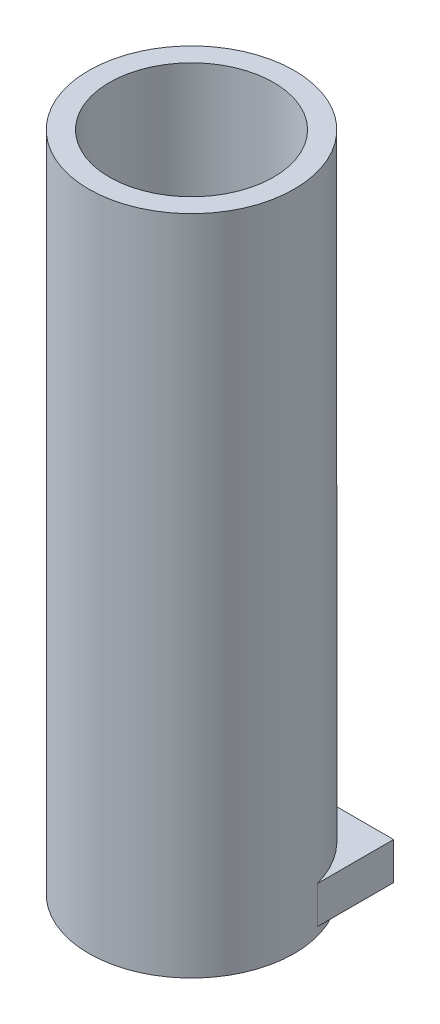
ISO-10303-21;
HEADER;
FILE_DESCRIPTION(('STEP AP214'),'2;1');
FILE_NAME('part.step','',(''),(''),'','','');
FILE_SCHEMA(('AUTOMOTIVE_DESIGN { 1 0 10303 214 1 1 1 1 }'));
ENDSEC;
DATA;
#1=APPLICATION_CONTEXT('core data for automotive mechanical design processes');
#2=APPLICATION_PROTOCOL_DEFINITION('international standard','automotive_design',2000,#1);
#3=PRODUCT_CONTEXT('',#1,'mechanical');
#4=PRODUCT('Part','Part','',(#3));
#5=PRODUCT_RELATED_PRODUCT_CATEGORY('part','',(#4));
#6=PRODUCT_DEFINITION_FORMATION('','',#4);
#7=PRODUCT_DEFINITION_CONTEXT('part definition',#1,'design');
#8=PRODUCT_DEFINITION('design','',#6,#7);
#9=PRODUCT_DEFINITION_SHAPE('','',#8);
#10=(LENGTH_UNIT() NAMED_UNIT(*) SI_UNIT(.MILLI.,.METRE.));
#11=(NAMED_UNIT(*) PLANE_ANGLE_UNIT() SI_UNIT($,.RADIAN.));
#12=(NAMED_UNIT(*) SI_UNIT($,.STERADIAN.) SOLID_ANGLE_UNIT());
#13=UNCERTAINTY_MEASURE_WITH_UNIT(LENGTH_MEASURE(1.E-05),#10,'distance_accuracy_value','');
#14=(GEOMETRIC_REPRESENTATION_CONTEXT(3) GLOBAL_UNCERTAINTY_ASSIGNED_CONTEXT((#13)) GLOBAL_UNIT_ASSIGNED_CONTEXT((#10,
#11,#12)) REPRESENTATION_CONTEXT('',''));
#15=CARTESIAN_POINT('',(0.,0.,0.));
#16=DIRECTION('',(0.,0.,1.));
#17=DIRECTION('',(1.,0.,0.));
#18=AXIS2_PLACEMENT_3D('',#15,#16,#17);
#19=CARTESIAN_POINT('',(0.,-80.,0.));
#20=DIRECTION('',(0.,1.,0.));
#21=DIRECTION('',(0.,0.,1.));
#22=AXIS2_PLACEMENT_3D('',#19,#20,#21);
#23=CYLINDRICAL_SURFACE('',#22,12.4187);
#24=CARTESIAN_POINT('',(0.,-74.4871839304295,0.));
#25=DIRECTION('',(0.,1.,0.));
#26=DIRECTION('',(0.,0.,1.));
#27=AXIS2_PLACEMENT_3D('',#24,#25,#26);
#28=CIRCLE('',#27,12.4187);
#29=CARTESIAN_POINT('',(12.,-74.4871839304295,-3.19751617509591));
#30=VERTEX_POINT('',#29);
#31=CARTESIAN_POINT('',(0.,-74.4871839304295,-12.4187));
#32=VERTEX_POINT('',#31);
#33=EDGE_CURVE('E88',#30,#32,#28,.T.);
#34=ORIENTED_EDGE('',*,*,#33,.T.);
#35=CARTESIAN_POINT('',(0.,-74.4871839304295,0.));
#36=DIRECTION('',(0.,1.,0.));
#37=DIRECTION('',(0.,0.,1.));
#38=AXIS2_PLACEMENT_3D('',#35,#36,#37);
#39=CIRCLE('',#38,12.4187);
#40=CARTESIAN_POINT('',(-12.,-74.4871839304295,-3.19751617509591));
#41=VERTEX_POINT('',#40);
#42=EDGE_CURVE('E109',#32,#41,#39,.T.);
#43=ORIENTED_EDGE('',*,*,#42,.T.);
#44=DIRECTION('',(0.,1.,0.));
#45=VECTOR('',#44,1.);
#46=CARTESIAN_POINT('',(-12.,-80.,-3.19751617509591));
#47=LINE('',#46,#45);
#48=CARTESIAN_POINT('',(-12.,-79.,-3.19751617509591));
#49=VERTEX_POINT('',#48);
#50=EDGE_CURVE('E113',#41,#49,#47,.F.);
#51=ORIENTED_EDGE('',*,*,#50,.T.);
#52=CARTESIAN_POINT('',(0.,-79.,0.));
#53=DIRECTION('',(0.,1.,0.));
#54=DIRECTION('',(0.,0.,1.));
#55=AXIS2_PLACEMENT_3D('',#52,#53,#54);
#56=CIRCLE('',#55,12.4187);
#57=CARTESIAN_POINT('',(0.,-79.,-12.4187));
#58=VERTEX_POINT('',#57);
#59=EDGE_CURVE('E114',#58,#49,#56,.T.);
#60=ORIENTED_EDGE('',*,*,#59,.F.);
#61=CARTESIAN_POINT('',(0.,-79.,0.));
#62=DIRECTION('',(0.,1.,0.));
#63=DIRECTION('',(0.,0.,1.));
#64=AXIS2_PLACEMENT_3D('',#61,#62,#63);
#65=CIRCLE('',#64,12.4187);
#66=CARTESIAN_POINT('',(12.,-79.,-3.1975161750959));
#67=VERTEX_POINT('',#66);
#68=EDGE_CURVE('E56',#67,#58,#65,.T.);
#69=ORIENTED_EDGE('',*,*,#68,.F.);
#70=DIRECTION('',(0.,1.,0.));
#71=VECTOR('',#70,1.);
#72=CARTESIAN_POINT('',(12.,-80.,-3.19751617509591));
#73=LINE('',#72,#71);
#74=EDGE_CURVE('E51',#67,#30,#73,.T.);
#75=ORIENTED_EDGE('',*,*,#74,.T.);
#76=EDGE_LOOP('',(#34,#43,#51,#60,#69,#75));
#77=FACE_BOUND('',#76,.T.);
#78=CARTESIAN_POINT('',(0.,-80.,0.));
#79=DIRECTION('',(0.,1.,0.));
#80=DIRECTION('',(0.,0.,1.));
#81=AXIS2_PLACEMENT_3D('',#78,#79,#80);
#82=CIRCLE('',#81,12.4187);
#83=CARTESIAN_POINT('',(0.,-80.,12.4187));
#84=VERTEX_POINT('',#83);
#85=EDGE_CURVE('E11',#84,#84,#82,.T.);
#86=ORIENTED_EDGE('',*,*,#85,.T.);
#87=EDGE_LOOP('',(#86));
#88=FACE_BOUND('',#87,.T.);
#89=CARTESIAN_POINT('',(0.,0.,0.));
#90=DIRECTION('',(0.,1.,0.));
#91=DIRECTION('',(0.,0.,1.));
#92=AXIS2_PLACEMENT_3D('',#89,#90,#91);
#93=CIRCLE('',#92,12.4187);
#94=CARTESIAN_POINT('',(0.,0.,12.4187));
#95=VERTEX_POINT('',#94);
#96=EDGE_CURVE('E40',#95,#95,#93,.T.);
#97=ORIENTED_EDGE('',*,*,#96,.F.);
#98=EDGE_LOOP('',(#97));
#99=FACE_BOUND('',#98,.T.);
#100=ADVANCED_FACE('F37',(#77,#88,#99),#23,.T.);
#101=CARTESIAN_POINT('',(0.,-80.,0.));
#102=DIRECTION('',(0.,1.,0.));
#103=DIRECTION('',(0.,0.,1.));
#104=AXIS2_PLACEMENT_3D('',#101,#102,#103);
#105=PLANE('',#104);
#106=ORIENTED_EDGE('',*,*,#85,.F.);
#107=EDGE_LOOP('',(#106));
#108=FACE_BOUND('',#107,.T.);
#109=ADVANCED_FACE('F139',(#108),#105,.F.);
#110=CARTESIAN_POINT('',(0.,0.,0.));
#111=DIRECTION('',(0.,1.,0.));
#112=DIRECTION('',(0.,0.,1.));
#113=AXIS2_PLACEMENT_3D('',#110,#111,#112);
#114=PLANE('',#113);
#115=CARTESIAN_POINT('',(0.,0.,0.));
#116=DIRECTION('',(0.,1.,0.));
#117=DIRECTION('',(0.,0.,1.));
#118=AXIS2_PLACEMENT_3D('',#115,#116,#117);
#119=CIRCLE('',#118,9.9187);
#120=CARTESIAN_POINT('',(0.,0.,9.9187));
#121=VERTEX_POINT('',#120);
#122=EDGE_CURVE('E112',#121,#121,#119,.T.);
#123=ORIENTED_EDGE('',*,*,#122,.F.);
#124=EDGE_LOOP('',(#123));
#125=FACE_BOUND('',#124,.T.);
#126=ORIENTED_EDGE('',*,*,#96,.T.);
#127=EDGE_LOOP('',(#126));
#128=FACE_BOUND('',#127,.T.);
#129=ADVANCED_FACE('F136',(#125,#128),#114,.T.);
#130=CARTESIAN_POINT('',(0.,-20.,0.));
#131=DIRECTION('',(0.,1.,0.));
#132=DIRECTION('',(0.,0.,1.));
#133=AXIS2_PLACEMENT_3D('',#130,#131,#132);
#134=CYLINDRICAL_SURFACE('',#133,9.9187);
#135=CARTESIAN_POINT('',(0.,-20.,0.));
#136=DIRECTION('',(0.,1.,0.));
#137=DIRECTION('',(0.,0.,1.));
#138=AXIS2_PLACEMENT_3D('',#135,#136,#137);
#139=CIRCLE('',#138,9.9187);
#140=CARTESIAN_POINT('',(0.,-20.,9.9187));
#141=VERTEX_POINT('',#140);
#142=EDGE_CURVE('E128',#141,#141,#139,.T.);
#143=ORIENTED_EDGE('',*,*,#142,.F.);
#144=EDGE_LOOP('',(#143));
#145=FACE_BOUND('',#144,.T.);
#146=ORIENTED_EDGE('',*,*,#122,.T.);
#147=EDGE_LOOP('',(#146));
#148=FACE_BOUND('',#147,.T.);
#149=ADVANCED_FACE('F134',(#145,#148),#134,.F.);
#150=CARTESIAN_POINT('',(0.,-20.,0.));
#151=DIRECTION('',(0.,1.,0.));
#152=DIRECTION('',(0.,0.,1.));
#153=AXIS2_PLACEMENT_3D('',#150,#151,#152);
#154=PLANE('',#153);
#155=ORIENTED_EDGE('',*,*,#142,.T.);
#156=EDGE_LOOP('',(#155));
#157=FACE_BOUND('',#156,.T.);
#158=ADVANCED_FACE('F218',(#157),#154,.T.);
#159=CARTESIAN_POINT('',(0.,0.,-12.4187));
#160=DIRECTION('',(0.,0.,-1.));
#161=DIRECTION('',(-1.,0.,0.));
#162=AXIS2_PLACEMENT_3D('',#159,#160,#161);
#163=PLANE('',#162);
#164=CARTESIAN_POINT('',(-10.45,-76.7435919652148,-12.4187));
#165=DIRECTION('',(0.,0.,-1.));
#166=DIRECTION('',(1.,0.,0.));
#167=AXIS2_PLACEMENT_3D('',#164,#165,#166);
#168=CIRCLE('',#167,0.600000000000006);
#169=CARTESIAN_POINT('',(-9.84999999999999,-76.7435919652148,-12.4187));
#170=VERTEX_POINT('',#169);
#171=EDGE_CURVE('E176',#170,#170,#168,.T.);
#172=ORIENTED_EDGE('',*,*,#171,.F.);
#173=EDGE_LOOP('',(#172));
#174=FACE_BOUND('',#173,.T.);
#175=CARTESIAN_POINT('',(10.45,-76.7435919652148,-12.4187));
#176=DIRECTION('',(0.,0.,-1.));
#177=DIRECTION('',(-1.,0.,0.));
#178=AXIS2_PLACEMENT_3D('',#175,#176,#177);
#179=CIRCLE('',#178,0.600000000000005);
#180=CARTESIAN_POINT('',(9.84999999999999,-76.7435919652148,-12.4187));
#181=VERTEX_POINT('',#180);
#182=EDGE_CURVE('E183',#181,#181,#179,.T.);
#183=ORIENTED_EDGE('',*,*,#182,.F.);
#184=EDGE_LOOP('',(#183));
#185=FACE_BOUND('',#184,.T.);
#186=CARTESIAN_POINT('',(8.45,-76.7435919652148,-12.4187));
#187=DIRECTION('',(0.,0.,-1.));
#188=DIRECTION('',(-1.,0.,0.));
#189=AXIS2_PLACEMENT_3D('',#186,#187,#188);
#190=CIRCLE('',#189,0.600000000000005);
#191=CARTESIAN_POINT('',(7.84999999999999,-76.7435919652148,-12.4187));
#192=VERTEX_POINT('',#191);
#193=EDGE_CURVE('E164',#192,#192,#190,.T.);
#194=ORIENTED_EDGE('',*,*,#193,.F.);
#195=EDGE_LOOP('',(#194));
#196=FACE_BOUND('',#195,.T.);
#197=CARTESIAN_POINT('',(6.45,-76.7435919652148,-12.4187));
#198=DIRECTION('',(0.,0.,-1.));
#199=DIRECTION('',(-1.,0.,0.));
#200=AXIS2_PLACEMENT_3D('',#197,#198,#199);
#201=CIRCLE('',#200,0.600000000000004);
#202=CARTESIAN_POINT('',(5.85,-76.7435919652148,-12.4187));
#203=VERTEX_POINT('',#202);
#204=EDGE_CURVE('E171',#203,#203,#201,.T.);
#205=ORIENTED_EDGE('',*,*,#204,.F.);
#206=EDGE_LOOP('',(#205));
#207=FACE_BOUND('',#206,.T.);
#208=CARTESIAN_POINT('',(-8.45,-76.7435919652148,-12.4187));
#209=DIRECTION('',(0.,0.,-1.));
#210=DIRECTION('',(1.,0.,0.));
#211=AXIS2_PLACEMENT_3D('',#208,#209,#210);
#212=CIRCLE('',#211,0.600000000000005);
#213=CARTESIAN_POINT('',(-7.84999999999999,-76.7435919652148,-12.4187));
#214=VERTEX_POINT('',#213);
#215=EDGE_CURVE('E200',#214,#214,#212,.T.);
#216=ORIENTED_EDGE('',*,*,#215,.F.);
#217=EDGE_LOOP('',(#216));
#218=FACE_BOUND('',#217,.T.);
#219=CARTESIAN_POINT('',(-6.45,-76.7435919652148,-12.4187));
#220=DIRECTION('',(0.,0.,-1.));
#221=DIRECTION('',(1.,0.,0.));
#222=AXIS2_PLACEMENT_3D('',#219,#220,#221);
#223=CIRCLE('',#222,0.600000000000003);
#224=CARTESIAN_POINT('',(-5.85,-76.7435919652148,-12.4187));
#225=VERTEX_POINT('',#224);
#226=EDGE_CURVE('E194',#225,#225,#223,.T.);
#227=ORIENTED_EDGE('',*,*,#226,.F.);
#228=EDGE_LOOP('',(#227));
#229=FACE_BOUND('',#228,.T.);
#230=CARTESIAN_POINT('',(-4.45,-76.7435919652148,-12.4187));
#231=DIRECTION('',(0.,0.,-1.));
#232=DIRECTION('',(1.,0.,0.));
#233=AXIS2_PLACEMENT_3D('',#230,#231,#232);
#234=CIRCLE('',#233,0.600000000000004);
#235=CARTESIAN_POINT('',(-3.85,-76.7435919652148,-12.4187));
#236=VERTEX_POINT('',#235);
#237=EDGE_CURVE('E188',#236,#236,#234,.T.);
#238=ORIENTED_EDGE('',*,*,#237,.F.);
#239=EDGE_LOOP('',(#238));
#240=FACE_BOUND('',#239,.T.);
#241=CARTESIAN_POINT('',(4.45,-76.7435919652148,-12.4187));
#242=DIRECTION('',(0.,0.,-1.));
#243=DIRECTION('',(-1.,0.,0.));
#244=AXIS2_PLACEMENT_3D('',#241,#242,#243);
#245=CIRCLE('',#244,0.600000000000003);
#246=CARTESIAN_POINT('',(3.85,-76.7435919652148,-12.4187));
#247=VERTEX_POINT('',#246);
#248=EDGE_CURVE('E158',#247,#247,#245,.T.);
#249=ORIENTED_EDGE('',*,*,#248,.F.);
#250=EDGE_LOOP('',(#249));
#251=FACE_BOUND('',#250,.T.);
#252=DIRECTION('',(1.,0.,0.));
#253=VECTOR('',#252,1.);
#254=CARTESIAN_POINT('',(0.,-74.4871839304295,-12.4187));
#255=LINE('',#254,#253);
#256=CARTESIAN_POINT('',(-12.,-74.4871839304295,-12.4187));
#257=VERTEX_POINT('',#256);
#258=EDGE_CURVE('E100',#257,#32,#255,.T.);
#259=ORIENTED_EDGE('',*,*,#258,.T.);
#260=DIRECTION('',(1.,0.,0.));
#261=VECTOR('',#260,1.);
#262=CARTESIAN_POINT('',(0.,-74.4871839304295,-12.4187));
#263=LINE('',#262,#261);
#264=CARTESIAN_POINT('',(12.,-74.4871839304295,-12.4187));
#265=VERTEX_POINT('',#264);
#266=EDGE_CURVE('E87',#32,#265,#263,.T.);
#267=ORIENTED_EDGE('',*,*,#266,.T.);
#268=DIRECTION('',(0.,-1.,0.));
#269=VECTOR('',#268,1.);
#270=CARTESIAN_POINT('',(12.,0.,-12.4187));
#271=LINE('',#270,#269);
#272=CARTESIAN_POINT('',(12.,-79.,-12.4187));
#273=VERTEX_POINT('',#272);
#274=EDGE_CURVE('E92',#265,#273,#271,.T.);
#275=ORIENTED_EDGE('',*,*,#274,.T.);
#276=DIRECTION('',(1.,0.,0.));
#277=VECTOR('',#276,1.);
#278=CARTESIAN_POINT('',(0.,-79.,-12.4187));
#279=LINE('',#278,#277);
#280=EDGE_CURVE('E152',#58,#273,#279,.T.);
#281=ORIENTED_EDGE('',*,*,#280,.F.);
#282=DIRECTION('',(1.,0.,0.));
#283=VECTOR('',#282,1.);
#284=CARTESIAN_POINT('',(0.,-79.,-12.4187));
#285=LINE('',#284,#283);
#286=CARTESIAN_POINT('',(-12.,-79.,-12.4187));
#287=VERTEX_POINT('',#286);
#288=EDGE_CURVE('E120',#287,#58,#285,.T.);
#289=ORIENTED_EDGE('',*,*,#288,.F.);
#290=DIRECTION('',(0.,1.,0.));
#291=VECTOR('',#290,1.);
#292=CARTESIAN_POINT('',(-12.,0.,-12.4187));
#293=LINE('',#292,#291);
#294=EDGE_CURVE('E122',#287,#257,#293,.T.);
#295=ORIENTED_EDGE('',*,*,#294,.T.);
#296=EDGE_LOOP('',(#259,#267,#275,#281,#289,#295));
#297=FACE_BOUND('',#296,.T.);
#298=ADVANCED_FACE('F96',(#174,#185,#196,#207,#218,#229,#240,#251,#297),#163,.T.);
#299=CARTESIAN_POINT('',(-12.,0.,12.4197));
#300=DIRECTION('',(-1.,0.,0.));
#301=DIRECTION('',(0.,0.,1.));
#302=AXIS2_PLACEMENT_3D('',#299,#300,#301);
#303=PLANE('',#302);
#304=ORIENTED_EDGE('',*,*,#50,.F.);
#305=DIRECTION('',(0.,0.,-1.));
#306=VECTOR('',#305,1.);
#307=CARTESIAN_POINT('',(-12.,-74.4871839304295,12.4197));
#308=LINE('',#307,#306);
#309=EDGE_CURVE('E117',#41,#257,#308,.T.);
#310=ORIENTED_EDGE('',*,*,#309,.T.);
#311=ORIENTED_EDGE('',*,*,#294,.F.);
#312=DIRECTION('',(0.,0.,-1.));
#313=VECTOR('',#312,1.);
#314=CARTESIAN_POINT('',(-12.,-79.,12.4197));
#315=LINE('',#314,#313);
#316=EDGE_CURVE('E125',#49,#287,#315,.T.);
#317=ORIENTED_EDGE('',*,*,#316,.F.);
#318=EDGE_LOOP('',(#304,#310,#311,#317));
#319=FACE_BOUND('',#318,.T.);
#320=ADVANCED_FACE('F217',(#319),#303,.T.);
#321=CARTESIAN_POINT('',(0.,-74.4871839304295,12.4197));
#322=DIRECTION('',(0.,1.,0.));
#323=DIRECTION('',(0.,0.,1.));
#324=AXIS2_PLACEMENT_3D('',#321,#322,#323);
#325=PLANE('',#324);
#326=ORIENTED_EDGE('',*,*,#42,.F.);
#327=ORIENTED_EDGE('',*,*,#258,.F.);
#328=ORIENTED_EDGE('',*,*,#309,.F.);
#329=EDGE_LOOP('',(#326,#327,#328));
#330=FACE_BOUND('',#329,.T.);
#331=ADVANCED_FACE('F249',(#330),#325,.T.);
#332=CARTESIAN_POINT('',(0.,-79.,12.4197));
#333=DIRECTION('',(0.,1.,0.));
#334=DIRECTION('',(0.,0.,1.));
#335=AXIS2_PLACEMENT_3D('',#332,#333,#334);
#336=PLANE('',#335);
#337=ORIENTED_EDGE('',*,*,#288,.T.);
#338=ORIENTED_EDGE('',*,*,#59,.T.);
#339=ORIENTED_EDGE('',*,*,#316,.T.);
#340=EDGE_LOOP('',(#337,#338,#339));
#341=FACE_BOUND('',#340,.T.);
#342=ADVANCED_FACE('F247',(#341),#336,.F.);
#343=CARTESIAN_POINT('',(0.,-74.4871839304295,12.4197));
#344=DIRECTION('',(0.,1.,0.));
#345=DIRECTION('',(0.,0.,1.));
#346=AXIS2_PLACEMENT_3D('',#343,#344,#345);
#347=PLANE('',#346);
#348=ORIENTED_EDGE('',*,*,#33,.F.);
#349=DIRECTION('',(0.,0.,-1.));
#350=VECTOR('',#349,1.);
#351=CARTESIAN_POINT('',(12.,-74.4871839304295,12.4197));
#352=LINE('',#351,#350);
#353=EDGE_CURVE('E84',#30,#265,#352,.T.);
#354=ORIENTED_EDGE('',*,*,#353,.T.);
#355=ORIENTED_EDGE('',*,*,#266,.F.);
#356=EDGE_LOOP('',(#348,#354,#355));
#357=FACE_BOUND('',#356,.T.);
#358=ADVANCED_FACE('F86',(#357),#347,.T.);
#359=CARTESIAN_POINT('',(12.,0.,12.4197));
#360=DIRECTION('',(1.,0.,0.));
#361=DIRECTION('',(0.,1.,0.));
#362=AXIS2_PLACEMENT_3D('',#359,#360,#361);
#363=PLANE('',#362);
#364=ORIENTED_EDGE('',*,*,#74,.F.);
#365=DIRECTION('',(0.,0.,-1.));
#366=VECTOR('',#365,1.);
#367=CARTESIAN_POINT('',(12.,-79.,12.4197));
#368=LINE('',#367,#366);
#369=EDGE_CURVE('E91',#67,#273,#368,.T.);
#370=ORIENTED_EDGE('',*,*,#369,.T.);
#371=ORIENTED_EDGE('',*,*,#274,.F.);
#372=ORIENTED_EDGE('',*,*,#353,.F.);
#373=EDGE_LOOP('',(#364,#370,#371,#372));
#374=FACE_BOUND('',#373,.T.);
#375=ADVANCED_FACE('F104',(#374),#363,.T.);
#376=CARTESIAN_POINT('',(0.,-79.,12.4197));
#377=DIRECTION('',(0.,1.,0.));
#378=DIRECTION('',(0.,0.,1.));
#379=AXIS2_PLACEMENT_3D('',#376,#377,#378);
#380=PLANE('',#379);
#381=ORIENTED_EDGE('',*,*,#369,.F.);
#382=ORIENTED_EDGE('',*,*,#68,.T.);
#383=ORIENTED_EDGE('',*,*,#280,.T.);
#384=EDGE_LOOP('',(#381,#382,#383));
#385=FACE_BOUND('',#384,.T.);
#386=ADVANCED_FACE('F230',(#385),#380,.F.);
#387=CARTESIAN_POINT('',(4.45,-76.7435919652148,-2.4187));
#388=DIRECTION('',(0.,0.,-1.));
#389=DIRECTION('',(-1.,0.,0.));
#390=AXIS2_PLACEMENT_3D('',#387,#388,#389);
#391=CYLINDRICAL_SURFACE('',#390,0.600000000000003);
#392=CARTESIAN_POINT('',(4.45,-76.7435919652148,-2.4187));
#393=DIRECTION('',(0.,0.,-1.));
#394=DIRECTION('',(-1.,0.,0.));
#395=AXIS2_PLACEMENT_3D('',#392,#393,#394);
#396=CIRCLE('',#395,0.600000000000003);
#397=CARTESIAN_POINT('',(3.85,-76.7435919652148,-2.4187));
#398=VERTEX_POINT('',#397);
#399=EDGE_CURVE('E102',#398,#398,#396,.T.);
#400=ORIENTED_EDGE('',*,*,#399,.F.);
#401=EDGE_LOOP('',(#400));
#402=FACE_BOUND('',#401,.T.);
#403=ORIENTED_EDGE('',*,*,#248,.T.);
#404=EDGE_LOOP('',(#403));
#405=FACE_BOUND('',#404,.T.);
#406=ADVANCED_FACE('F227',(#402,#405),#391,.F.);
#407=CARTESIAN_POINT('',(4.45,-76.7435919652148,-2.4187));
#408=DIRECTION('',(0.,0.,-1.));
#409=DIRECTION('',(-1.,0.,0.));
#410=AXIS2_PLACEMENT_3D('',#407,#408,#409);
#411=PLANE('',#410);
#412=ORIENTED_EDGE('',*,*,#399,.T.);
#413=EDGE_LOOP('',(#412));
#414=FACE_BOUND('',#413,.T.);
#415=ADVANCED_FACE('F229',(#414),#411,.T.);
#416=CARTESIAN_POINT('',(-4.45,-76.7435919652148,-2.4187));
#417=DIRECTION('',(0.,0.,-1.));
#418=DIRECTION('',(-1.,0.,0.));
#419=AXIS2_PLACEMENT_3D('',#416,#417,#418);
#420=CYLINDRICAL_SURFACE('',#419,0.600000000000004);
#421=CARTESIAN_POINT('',(-4.45,-76.7435919652148,-2.4187));
#422=DIRECTION('',(0.,0.,-1.));
#423=DIRECTION('',(1.,0.,0.));
#424=AXIS2_PLACEMENT_3D('',#421,#422,#423);
#425=CIRCLE('',#424,0.600000000000004);
#426=CARTESIAN_POINT('',(-3.85,-76.7435919652148,-2.4187));
#427=VERTEX_POINT('',#426);
#428=EDGE_CURVE('E191',#427,#427,#425,.T.);
#429=ORIENTED_EDGE('',*,*,#428,.F.);
#430=EDGE_LOOP('',(#429));
#431=FACE_BOUND('',#430,.T.);
#432=ORIENTED_EDGE('',*,*,#237,.T.);
#433=EDGE_LOOP('',(#432));
#434=FACE_BOUND('',#433,.T.);
#435=ADVANCED_FACE('F237',(#431,#434),#420,.F.);
#436=CARTESIAN_POINT('',(-4.45,-76.7435919652148,-2.4187));
#437=DIRECTION('',(0.,0.,1.));
#438=DIRECTION('',(1.,0.,0.));
#439=AXIS2_PLACEMENT_3D('',#436,#437,#438);
#440=PLANE('',#439);
#441=ORIENTED_EDGE('',*,*,#428,.T.);
#442=EDGE_LOOP('',(#441));
#443=FACE_BOUND('',#442,.T.);
#444=ADVANCED_FACE('F322',(#443),#440,.F.);
#445=CARTESIAN_POINT('',(-6.45,-76.7435919652148,-2.4187));
#446=DIRECTION('',(0.,0.,-1.));
#447=DIRECTION('',(-1.,0.,0.));
#448=AXIS2_PLACEMENT_3D('',#445,#446,#447);
#449=CYLINDRICAL_SURFACE('',#448,0.600000000000003);
#450=CARTESIAN_POINT('',(-6.45,-76.7435919652148,-2.4187));
#451=DIRECTION('',(0.,0.,-1.));
#452=DIRECTION('',(1.,0.,0.));
#453=AXIS2_PLACEMENT_3D('',#450,#451,#452);
#454=CIRCLE('',#453,0.600000000000003);
#455=CARTESIAN_POINT('',(-5.85,-76.7435919652148,-2.4187));
#456=VERTEX_POINT('',#455);
#457=EDGE_CURVE('E197',#456,#456,#454,.T.);
#458=ORIENTED_EDGE('',*,*,#457,.F.);
#459=EDGE_LOOP('',(#458));
#460=FACE_BOUND('',#459,.T.);
#461=ORIENTED_EDGE('',*,*,#226,.T.);
#462=EDGE_LOOP('',(#461));
#463=FACE_BOUND('',#462,.T.);
#464=ADVANCED_FACE('F331',(#460,#463),#449,.F.);
#465=CARTESIAN_POINT('',(-6.45,-76.7435919652148,-2.4187));
#466=DIRECTION('',(0.,0.,1.));
#467=DIRECTION('',(1.,0.,0.));
#468=AXIS2_PLACEMENT_3D('',#465,#466,#467);
#469=PLANE('',#468);
#470=ORIENTED_EDGE('',*,*,#457,.T.);
#471=EDGE_LOOP('',(#470));
#472=FACE_BOUND('',#471,.T.);
#473=ADVANCED_FACE('F211',(#472),#469,.F.);
#474=CARTESIAN_POINT('',(-8.45,-76.7435919652148,-2.4187));
#475=DIRECTION('',(0.,0.,-1.));
#476=DIRECTION('',(-1.,0.,0.));
#477=AXIS2_PLACEMENT_3D('',#474,#475,#476);
#478=CYLINDRICAL_SURFACE('',#477,0.600000000000005);
#479=CARTESIAN_POINT('',(-8.45,-76.7435919652148,-2.4187));
#480=DIRECTION('',(0.,0.,-1.));
#481=DIRECTION('',(1.,0.,0.));
#482=AXIS2_PLACEMENT_3D('',#479,#480,#481);
#483=CIRCLE('',#482,0.600000000000005);
#484=CARTESIAN_POINT('',(-7.84999999999999,-76.7435919652148,-2.4187));
#485=VERTEX_POINT('',#484);
#486=EDGE_CURVE('E180',#485,#485,#483,.T.);
#487=ORIENTED_EDGE('',*,*,#486,.F.);
#488=EDGE_LOOP('',(#487));
#489=FACE_BOUND('',#488,.T.);
#490=ORIENTED_EDGE('',*,*,#215,.T.);
#491=EDGE_LOOP('',(#490));
#492=FACE_BOUND('',#491,.T.);
#493=ADVANCED_FACE('F208',(#489,#492),#478,.F.);
#494=CARTESIAN_POINT('',(-8.45,-76.7435919652148,-2.4187));
#495=DIRECTION('',(0.,0.,1.));
#496=DIRECTION('',(1.,0.,0.));
#497=AXIS2_PLACEMENT_3D('',#494,#495,#496);
#498=PLANE('',#497);
#499=ORIENTED_EDGE('',*,*,#486,.T.);
#500=EDGE_LOOP('',(#499));
#501=FACE_BOUND('',#500,.T.);
#502=ADVANCED_FACE('F206',(#501),#498,.F.);
#503=CARTESIAN_POINT('',(6.45,-76.7435919652148,-2.4187));
#504=DIRECTION('',(0.,0.,-1.));
#505=DIRECTION('',(-1.,0.,0.));
#506=AXIS2_PLACEMENT_3D('',#503,#504,#505);
#507=CYLINDRICAL_SURFACE('',#506,0.600000000000004);
#508=CARTESIAN_POINT('',(6.45,-76.7435919652148,-2.4187));
#509=DIRECTION('',(0.,0.,-1.));
#510=DIRECTION('',(-1.,0.,0.));
#511=AXIS2_PLACEMENT_3D('',#508,#509,#510);
#512=CIRCLE('',#511,0.600000000000004);
#513=CARTESIAN_POINT('',(5.85,-76.7435919652148,-2.4187));
#514=VERTEX_POINT('',#513);
#515=EDGE_CURVE('E161',#514,#514,#512,.T.);
#516=ORIENTED_EDGE('',*,*,#515,.F.);
#517=EDGE_LOOP('',(#516));
#518=FACE_BOUND('',#517,.T.);
#519=ORIENTED_EDGE('',*,*,#204,.T.);
#520=EDGE_LOOP('',(#519));
#521=FACE_BOUND('',#520,.T.);
#522=ADVANCED_FACE('F361',(#518,#521),#507,.F.);
#523=CARTESIAN_POINT('',(6.45,-76.7435919652148,-2.4187));
#524=DIRECTION('',(0.,0.,-1.));
#525=DIRECTION('',(-1.,0.,0.));
#526=AXIS2_PLACEMENT_3D('',#523,#524,#525);
#527=PLANE('',#526);
#528=ORIENTED_EDGE('',*,*,#515,.T.);
#529=EDGE_LOOP('',(#528));
#530=FACE_BOUND('',#529,.T.);
#531=ADVANCED_FACE('F369',(#530),#527,.T.);
#532=CARTESIAN_POINT('',(8.45,-76.7435919652148,-2.4187));
#533=DIRECTION('',(0.,0.,-1.));
#534=DIRECTION('',(-1.,0.,0.));
#535=AXIS2_PLACEMENT_3D('',#532,#533,#534);
#536=CYLINDRICAL_SURFACE('',#535,0.600000000000005);
#537=CARTESIAN_POINT('',(8.45,-76.7435919652148,-2.4187));
#538=DIRECTION('',(0.,0.,-1.));
#539=DIRECTION('',(-1.,0.,0.));
#540=AXIS2_PLACEMENT_3D('',#537,#538,#539);
#541=CIRCLE('',#540,0.600000000000005);
#542=CARTESIAN_POINT('',(7.84999999999999,-76.7435919652148,-2.4187));
#543=VERTEX_POINT('',#542);
#544=EDGE_CURVE('E167',#543,#543,#541,.T.);
#545=ORIENTED_EDGE('',*,*,#544,.F.);
#546=EDGE_LOOP('',(#545));
#547=FACE_BOUND('',#546,.T.);
#548=ORIENTED_EDGE('',*,*,#193,.T.);
#549=EDGE_LOOP('',(#548));
#550=FACE_BOUND('',#549,.T.);
#551=ADVANCED_FACE('F378',(#547,#550),#536,.F.);
#552=CARTESIAN_POINT('',(8.45,-76.7435919652148,-2.4187));
#553=DIRECTION('',(0.,0.,-1.));
#554=DIRECTION('',(-1.,0.,0.));
#555=AXIS2_PLACEMENT_3D('',#552,#553,#554);
#556=PLANE('',#555);
#557=ORIENTED_EDGE('',*,*,#544,.T.);
#558=EDGE_LOOP('',(#557));
#559=FACE_BOUND('',#558,.T.);
#560=ADVANCED_FACE('F387',(#559),#556,.T.);
#561=CARTESIAN_POINT('',(10.45,-76.7435919652148,-2.4187));
#562=DIRECTION('',(0.,0.,-1.));
#563=DIRECTION('',(-1.,0.,0.));
#564=AXIS2_PLACEMENT_3D('',#561,#562,#563);
#565=CYLINDRICAL_SURFACE('',#564,0.600000000000005);
#566=CARTESIAN_POINT('',(10.45,-76.7435919652148,-2.4187));
#567=DIRECTION('',(0.,0.,-1.));
#568=DIRECTION('',(-1.,0.,0.));
#569=AXIS2_PLACEMENT_3D('',#566,#567,#568);
#570=CIRCLE('',#569,0.600000000000005);
#571=CARTESIAN_POINT('',(9.84999999999999,-76.7435919652148,-2.4187));
#572=VERTEX_POINT('',#571);
#573=EDGE_CURVE('E168',#572,#572,#570,.T.);
#574=ORIENTED_EDGE('',*,*,#573,.F.);
#575=EDGE_LOOP('',(#574));
#576=FACE_BOUND('',#575,.T.);
#577=ORIENTED_EDGE('',*,*,#182,.T.);
#578=EDGE_LOOP('',(#577));
#579=FACE_BOUND('',#578,.T.);
#580=ADVANCED_FACE('F395',(#576,#579),#565,.F.);
#581=CARTESIAN_POINT('',(10.45,-76.7435919652148,-2.4187));
#582=DIRECTION('',(0.,0.,-1.));
#583=DIRECTION('',(-1.,0.,0.));
#584=AXIS2_PLACEMENT_3D('',#581,#582,#583);
#585=PLANE('',#584);
#586=ORIENTED_EDGE('',*,*,#573,.T.);
#587=EDGE_LOOP('',(#586));
#588=FACE_BOUND('',#587,.T.);
#589=ADVANCED_FACE('F404',(#588),#585,.T.);
#590=CARTESIAN_POINT('',(-10.45,-76.7435919652148,-2.4187));
#591=DIRECTION('',(0.,0.,-1.));
#592=DIRECTION('',(-1.,0.,0.));
#593=AXIS2_PLACEMENT_3D('',#590,#591,#592);
#594=CYLINDRICAL_SURFACE('',#593,0.600000000000006);
#595=CARTESIAN_POINT('',(-10.45,-76.7435919652148,-2.4187));
#596=DIRECTION('',(0.,0.,-1.));
#597=DIRECTION('',(1.,0.,0.));
#598=AXIS2_PLACEMENT_3D('',#595,#596,#597);
#599=CIRCLE('',#598,0.600000000000006);
#600=CARTESIAN_POINT('',(-9.84999999999999,-76.7435919652148,-2.4187));
#601=VERTEX_POINT('',#600);
#602=EDGE_CURVE('E179',#601,#601,#599,.T.);
#603=ORIENTED_EDGE('',*,*,#602,.F.);
#604=EDGE_LOOP('',(#603));
#605=FACE_BOUND('',#604,.T.);
#606=ORIENTED_EDGE('',*,*,#171,.T.);
#607=EDGE_LOOP('',(#606));
#608=FACE_BOUND('',#607,.T.);
#609=ADVANCED_FACE('F413',(#605,#608),#594,.F.);
#610=CARTESIAN_POINT('',(-10.45,-76.7435919652148,-2.4187));
#611=DIRECTION('',(0.,0.,1.));
#612=DIRECTION('',(1.,0.,0.));
#613=AXIS2_PLACEMENT_3D('',#610,#611,#612);
#614=PLANE('',#613);
#615=ORIENTED_EDGE('',*,*,#602,.T.);
#616=EDGE_LOOP('',(#615));
#617=FACE_BOUND('',#616,.T.);
#618=ADVANCED_FACE('F422',(#617),#614,.F.);
#619=CLOSED_SHELL('',(#100,#109,#129,#149,#158,#298,#320,#331,#342,#358,#375,#386,#406,#415,
#435,#444,#464,#473,#493,#502,#522,#531,#551,#560,#580,#589,#609,#618));
#620=MANIFOLD_SOLID_BREP('B2',#619);
#621=ADVANCED_BREP_SHAPE_REPRESENTATION('',(#18,#620),#14);
#622=SHAPE_DEFINITION_REPRESENTATION(#9,#621);
ENDSEC;
END-ISO-10303-21;
